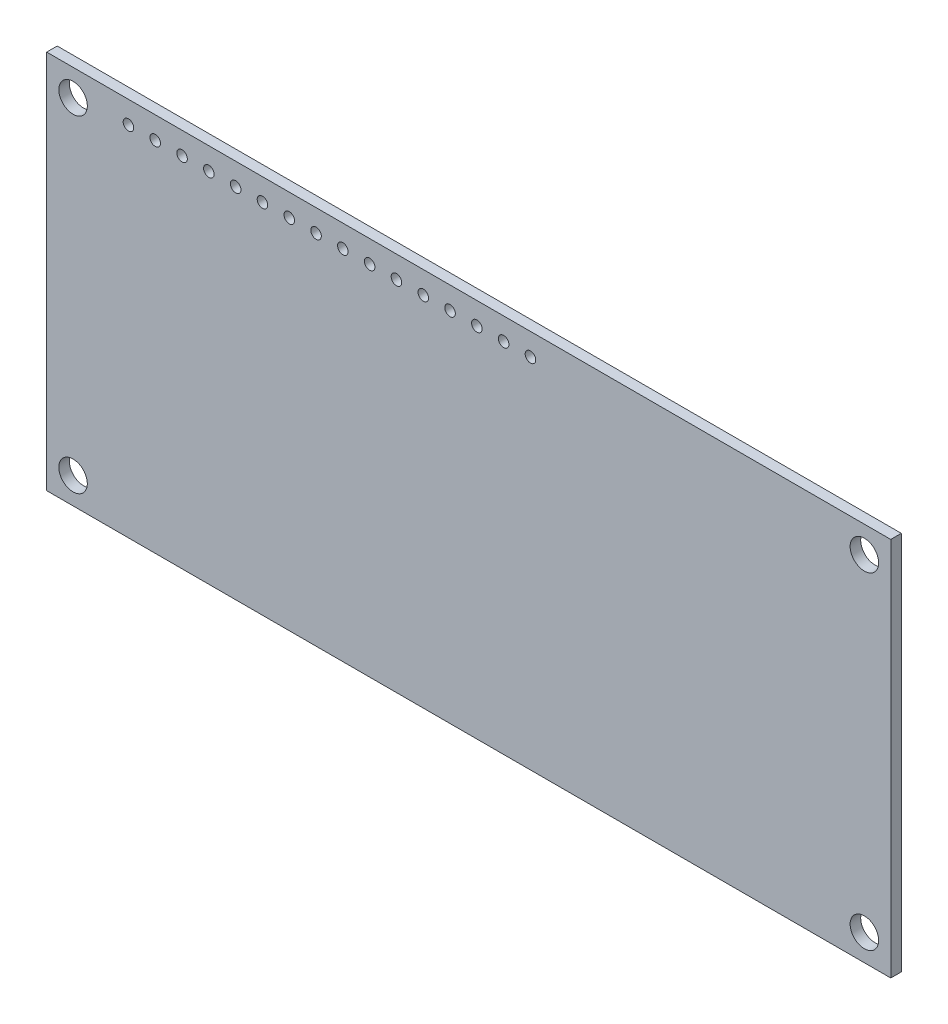
ISO-10303-21;
HEADER;
FILE_DESCRIPTION(('STEP AP214'),'2;1');
FILE_NAME('part.step','',(''),(''),'','','');
FILE_SCHEMA(('AUTOMOTIVE_DESIGN { 1 0 10303 214 1 1 1 1 }'));
ENDSEC;
DATA;
#1=APPLICATION_CONTEXT('core data for automotive mechanical design processes');
#2=APPLICATION_PROTOCOL_DEFINITION('international standard','automotive_design',2000,#1);
#3=PRODUCT_CONTEXT('',#1,'mechanical');
#4=PRODUCT('Part','Part','',(#3));
#5=PRODUCT_RELATED_PRODUCT_CATEGORY('part','',(#4));
#6=PRODUCT_DEFINITION_FORMATION('','',#4);
#7=PRODUCT_DEFINITION_CONTEXT('part definition',#1,'design');
#8=PRODUCT_DEFINITION('design','',#6,#7);
#9=PRODUCT_DEFINITION_SHAPE('','',#8);
#10=(LENGTH_UNIT() NAMED_UNIT(*) SI_UNIT(.MILLI.,.METRE.));
#11=(NAMED_UNIT(*) PLANE_ANGLE_UNIT() SI_UNIT($,.RADIAN.));
#12=(NAMED_UNIT(*) SI_UNIT($,.STERADIAN.) SOLID_ANGLE_UNIT());
#13=UNCERTAINTY_MEASURE_WITH_UNIT(LENGTH_MEASURE(1.E-05),#10,'distance_accuracy_value','');
#14=(GEOMETRIC_REPRESENTATION_CONTEXT(3) GLOBAL_UNCERTAINTY_ASSIGNED_CONTEXT((#13)) GLOBAL_UNIT_ASSIGNED_CONTEXT((#10,
#11,#12)) REPRESENTATION_CONTEXT('',''));
#15=CARTESIAN_POINT('',(0.,0.,0.));
#16=DIRECTION('',(0.,0.,1.));
#17=DIRECTION('',(1.,0.,0.));
#18=AXIS2_PLACEMENT_3D('',#15,#16,#17);
#19=CARTESIAN_POINT('',(0.,0.,-1.));
#20=DIRECTION('',(0.,0.,-1.));
#21=DIRECTION('',(-1.,0.,0.));
#22=AXIS2_PLACEMENT_3D('',#19,#20,#21);
#23=PLANE('',#22);
#24=CARTESIAN_POINT('',(-32.25,15.9,-1.));
#25=DIRECTION('',(0.,0.,-1.));
#26=DIRECTION('',(-1.,0.,0.));
#27=AXIS2_PLACEMENT_3D('',#24,#25,#26);
#28=CIRCLE('',#27,0.5);
#29=CARTESIAN_POINT('',(-32.75,15.9,-1.));
#30=VERTEX_POINT('',#29);
#31=EDGE_CURVE('E138',#30,#30,#28,.F.);
#32=ORIENTED_EDGE('',*,*,#31,.T.);
#33=EDGE_LOOP('',(#32));
#34=FACE_BOUND('',#33,.T.);
#35=CARTESIAN_POINT('',(-29.71,15.9,-1.));
#36=DIRECTION('',(0.,0.,-1.));
#37=DIRECTION('',(-1.,0.,0.));
#38=AXIS2_PLACEMENT_3D('',#35,#36,#37);
#39=CIRCLE('',#38,0.5);
#40=CARTESIAN_POINT('',(-30.21,15.9,-1.));
#41=VERTEX_POINT('',#40);
#42=EDGE_CURVE('E142',#41,#41,#39,.F.);
#43=ORIENTED_EDGE('',*,*,#42,.T.);
#44=EDGE_LOOP('',(#43));
#45=FACE_BOUND('',#44,.T.);
#46=CARTESIAN_POINT('',(-27.17,15.9,-1.));
#47=DIRECTION('',(0.,0.,-1.));
#48=DIRECTION('',(-1.,0.,0.));
#49=AXIS2_PLACEMENT_3D('',#46,#47,#48);
#50=CIRCLE('',#49,0.5);
#51=CARTESIAN_POINT('',(-27.67,15.9,-1.));
#52=VERTEX_POINT('',#51);
#53=EDGE_CURVE('E145',#52,#52,#50,.F.);
#54=ORIENTED_EDGE('',*,*,#53,.T.);
#55=EDGE_LOOP('',(#54));
#56=FACE_BOUND('',#55,.T.);
#57=CARTESIAN_POINT('',(-24.63,15.9,-1.));
#58=DIRECTION('',(0.,0.,-1.));
#59=DIRECTION('',(-1.,0.,0.));
#60=AXIS2_PLACEMENT_3D('',#57,#58,#59);
#61=CIRCLE('',#60,0.5);
#62=CARTESIAN_POINT('',(-25.13,15.9,-1.));
#63=VERTEX_POINT('',#62);
#64=EDGE_CURVE('E148',#63,#63,#61,.F.);
#65=ORIENTED_EDGE('',*,*,#64,.T.);
#66=EDGE_LOOP('',(#65));
#67=FACE_BOUND('',#66,.T.);
#68=CARTESIAN_POINT('',(-22.09,15.9,-1.));
#69=DIRECTION('',(0.,0.,-1.));
#70=DIRECTION('',(-1.,0.,0.));
#71=AXIS2_PLACEMENT_3D('',#68,#69,#70);
#72=CIRCLE('',#71,0.5);
#73=CARTESIAN_POINT('',(-22.59,15.9,-1.));
#74=VERTEX_POINT('',#73);
#75=EDGE_CURVE('E151',#74,#74,#72,.F.);
#76=ORIENTED_EDGE('',*,*,#75,.T.);
#77=EDGE_LOOP('',(#76));
#78=FACE_BOUND('',#77,.T.);
#79=CARTESIAN_POINT('',(-19.55,15.9,-1.));
#80=DIRECTION('',(0.,0.,-1.));
#81=DIRECTION('',(-1.,0.,0.));
#82=AXIS2_PLACEMENT_3D('',#79,#80,#81);
#83=CIRCLE('',#82,0.5);
#84=CARTESIAN_POINT('',(-20.05,15.9,-1.));
#85=VERTEX_POINT('',#84);
#86=EDGE_CURVE('E154',#85,#85,#83,.F.);
#87=ORIENTED_EDGE('',*,*,#86,.T.);
#88=EDGE_LOOP('',(#87));
#89=FACE_BOUND('',#88,.T.);
#90=CARTESIAN_POINT('',(-17.01,15.9,-1.));
#91=DIRECTION('',(0.,0.,-1.));
#92=DIRECTION('',(-1.,0.,0.));
#93=AXIS2_PLACEMENT_3D('',#90,#91,#92);
#94=CIRCLE('',#93,0.5);
#95=CARTESIAN_POINT('',(-17.51,15.9,-1.));
#96=VERTEX_POINT('',#95);
#97=EDGE_CURVE('E157',#96,#96,#94,.F.);
#98=ORIENTED_EDGE('',*,*,#97,.T.);
#99=EDGE_LOOP('',(#98));
#100=FACE_BOUND('',#99,.T.);
#101=CARTESIAN_POINT('',(-14.47,15.9,-1.));
#102=DIRECTION('',(0.,0.,-1.));
#103=DIRECTION('',(-1.,0.,0.));
#104=AXIS2_PLACEMENT_3D('',#101,#102,#103);
#105=CIRCLE('',#104,0.5);
#106=CARTESIAN_POINT('',(-14.97,15.9,-1.));
#107=VERTEX_POINT('',#106);
#108=EDGE_CURVE('E160',#107,#107,#105,.F.);
#109=ORIENTED_EDGE('',*,*,#108,.T.);
#110=EDGE_LOOP('',(#109));
#111=FACE_BOUND('',#110,.T.);
#112=CARTESIAN_POINT('',(-11.93,15.9,-1.));
#113=DIRECTION('',(0.,0.,-1.));
#114=DIRECTION('',(-1.,0.,0.));
#115=AXIS2_PLACEMENT_3D('',#112,#113,#114);
#116=CIRCLE('',#115,0.5);
#117=CARTESIAN_POINT('',(-12.43,15.9,-1.));
#118=VERTEX_POINT('',#117);
#119=EDGE_CURVE('E163',#118,#118,#116,.F.);
#120=ORIENTED_EDGE('',*,*,#119,.T.);
#121=EDGE_LOOP('',(#120));
#122=FACE_BOUND('',#121,.T.);
#123=CARTESIAN_POINT('',(-9.39,15.9,-1.));
#124=DIRECTION('',(0.,0.,-1.));
#125=DIRECTION('',(-1.,0.,0.));
#126=AXIS2_PLACEMENT_3D('',#123,#124,#125);
#127=CIRCLE('',#126,0.5);
#128=CARTESIAN_POINT('',(-9.89,15.9,-1.));
#129=VERTEX_POINT('',#128);
#130=EDGE_CURVE('E166',#129,#129,#127,.F.);
#131=ORIENTED_EDGE('',*,*,#130,.T.);
#132=EDGE_LOOP('',(#131));
#133=FACE_BOUND('',#132,.T.);
#134=CARTESIAN_POINT('',(-6.85,15.9,-1.));
#135=DIRECTION('',(0.,0.,-1.));
#136=DIRECTION('',(-1.,0.,0.));
#137=AXIS2_PLACEMENT_3D('',#134,#135,#136);
#138=CIRCLE('',#137,0.5);
#139=CARTESIAN_POINT('',(-7.35,15.9,-1.));
#140=VERTEX_POINT('',#139);
#141=EDGE_CURVE('E169',#140,#140,#138,.F.);
#142=ORIENTED_EDGE('',*,*,#141,.T.);
#143=EDGE_LOOP('',(#142));
#144=FACE_BOUND('',#143,.T.);
#145=CARTESIAN_POINT('',(-4.31,15.9,-1.));
#146=DIRECTION('',(0.,0.,-1.));
#147=DIRECTION('',(-1.,0.,0.));
#148=AXIS2_PLACEMENT_3D('',#145,#146,#147);
#149=CIRCLE('',#148,0.5);
#150=CARTESIAN_POINT('',(-4.81,15.9,-1.));
#151=VERTEX_POINT('',#150);
#152=EDGE_CURVE('E172',#151,#151,#149,.F.);
#153=ORIENTED_EDGE('',*,*,#152,.T.);
#154=EDGE_LOOP('',(#153));
#155=FACE_BOUND('',#154,.T.);
#156=CARTESIAN_POINT('',(-1.77,15.9,-1.));
#157=DIRECTION('',(0.,0.,-1.));
#158=DIRECTION('',(-1.,0.,0.));
#159=AXIS2_PLACEMENT_3D('',#156,#157,#158);
#160=CIRCLE('',#159,0.5);
#161=CARTESIAN_POINT('',(-2.27,15.9,-1.));
#162=VERTEX_POINT('',#161);
#163=EDGE_CURVE('E175',#162,#162,#160,.F.);
#164=ORIENTED_EDGE('',*,*,#163,.T.);
#165=EDGE_LOOP('',(#164));
#166=FACE_BOUND('',#165,.T.);
#167=CARTESIAN_POINT('',(0.77,15.9,-1.));
#168=DIRECTION('',(0.,0.,-1.));
#169=DIRECTION('',(-1.,0.,0.));
#170=AXIS2_PLACEMENT_3D('',#167,#168,#169);
#171=CIRCLE('',#170,0.5);
#172=CARTESIAN_POINT('',(0.27,15.9,-1.));
#173=VERTEX_POINT('',#172);
#174=EDGE_CURVE('E178',#173,#173,#171,.F.);
#175=ORIENTED_EDGE('',*,*,#174,.T.);
#176=EDGE_LOOP('',(#175));
#177=FACE_BOUND('',#176,.T.);
#178=CARTESIAN_POINT('',(3.31,15.9,-1.));
#179=DIRECTION('',(0.,0.,-1.));
#180=DIRECTION('',(-1.,0.,0.));
#181=AXIS2_PLACEMENT_3D('',#178,#179,#180);
#182=CIRCLE('',#181,0.5);
#183=CARTESIAN_POINT('',(2.81,15.9,-1.));
#184=VERTEX_POINT('',#183);
#185=EDGE_CURVE('E181',#184,#184,#182,.F.);
#186=ORIENTED_EDGE('',*,*,#185,.T.);
#187=EDGE_LOOP('',(#186));
#188=FACE_BOUND('',#187,.T.);
#189=CARTESIAN_POINT('',(5.85,15.9,-1.));
#190=DIRECTION('',(0.,0.,-1.));
#191=DIRECTION('',(-1.,0.,0.));
#192=AXIS2_PLACEMENT_3D('',#189,#190,#191);
#193=CIRCLE('',#192,0.5);
#194=CARTESIAN_POINT('',(5.35,15.9,-1.));
#195=VERTEX_POINT('',#194);
#196=EDGE_CURVE('E184',#195,#195,#193,.F.);
#197=ORIENTED_EDGE('',*,*,#196,.T.);
#198=EDGE_LOOP('',(#197));
#199=FACE_BOUND('',#198,.T.);
#200=CARTESIAN_POINT('',(-37.5,15.5,-1.));
#201=DIRECTION('',(0.,0.,-1.));
#202=DIRECTION('',(-1.,0.,0.));
#203=AXIS2_PLACEMENT_3D('',#200,#201,#202);
#204=CIRCLE('',#203,1.35);
#205=CARTESIAN_POINT('',(-38.85,15.5,-1.));
#206=VERTEX_POINT('',#205);
#207=EDGE_CURVE('E187',#206,#206,#204,.F.);
#208=ORIENTED_EDGE('',*,*,#207,.T.);
#209=EDGE_LOOP('',(#208));
#210=FACE_BOUND('',#209,.T.);
#211=CARTESIAN_POINT('',(-37.5,-15.5,-1.));
#212=DIRECTION('',(0.,0.,-1.));
#213=DIRECTION('',(-1.,0.,0.));
#214=AXIS2_PLACEMENT_3D('',#211,#212,#213);
#215=CIRCLE('',#214,1.35);
#216=CARTESIAN_POINT('',(-38.85,-15.5,-1.));
#217=VERTEX_POINT('',#216);
#218=EDGE_CURVE('E190',#217,#217,#215,.F.);
#219=ORIENTED_EDGE('',*,*,#218,.T.);
#220=EDGE_LOOP('',(#219));
#221=FACE_BOUND('',#220,.T.);
#222=CARTESIAN_POINT('',(37.5,15.5,-1.));
#223=DIRECTION('',(0.,0.,-1.));
#224=DIRECTION('',(-1.,0.,0.));
#225=AXIS2_PLACEMENT_3D('',#222,#223,#224);
#226=CIRCLE('',#225,1.35);
#227=CARTESIAN_POINT('',(36.15,15.5,-1.));
#228=VERTEX_POINT('',#227);
#229=EDGE_CURVE('E192',#228,#228,#226,.F.);
#230=ORIENTED_EDGE('',*,*,#229,.T.);
#231=EDGE_LOOP('',(#230));
#232=FACE_BOUND('',#231,.T.);
#233=CARTESIAN_POINT('',(37.5,-15.5,-1.));
#234=DIRECTION('',(0.,0.,-1.));
#235=DIRECTION('',(-1.,0.,0.));
#236=AXIS2_PLACEMENT_3D('',#233,#234,#235);
#237=CIRCLE('',#236,1.35);
#238=CARTESIAN_POINT('',(36.15,-15.5,-1.));
#239=VERTEX_POINT('',#238);
#240=EDGE_CURVE('E20',#239,#239,#237,.F.);
#241=ORIENTED_EDGE('',*,*,#240,.T.);
#242=EDGE_LOOP('',(#241));
#243=FACE_BOUND('',#242,.T.);
#244=DIRECTION('',(1.,0.,0.));
#245=VECTOR('',#244,1.);
#246=CARTESIAN_POINT('',(-40.,18.,-1.));
#247=LINE('',#246,#245);
#248=CARTESIAN_POINT('',(40.,18.,-1.));
#249=VERTEX_POINT('',#248);
#250=CARTESIAN_POINT('',(-40.,18.,-1.));
#251=VERTEX_POINT('',#250);
#252=EDGE_CURVE('E70',#249,#251,#247,.F.);
#253=ORIENTED_EDGE('',*,*,#252,.F.);
#254=DIRECTION('',(0.,1.,0.));
#255=VECTOR('',#254,1.);
#256=CARTESIAN_POINT('',(40.,18.,-1.));
#257=LINE('',#256,#255);
#258=CARTESIAN_POINT('',(40.,-18.,-1.));
#259=VERTEX_POINT('',#258);
#260=EDGE_CURVE('E55',#259,#249,#257,.T.);
#261=ORIENTED_EDGE('',*,*,#260,.F.);
#262=DIRECTION('',(1.,0.,0.));
#263=VECTOR('',#262,1.);
#264=CARTESIAN_POINT('',(40.,-18.,-1.));
#265=LINE('',#264,#263);
#266=CARTESIAN_POINT('',(-40.,-18.,-1.));
#267=VERTEX_POINT('',#266);
#268=EDGE_CURVE('E60',#267,#259,#265,.T.);
#269=ORIENTED_EDGE('',*,*,#268,.F.);
#270=DIRECTION('',(0.,1.,0.));
#271=VECTOR('',#270,1.);
#272=CARTESIAN_POINT('',(-40.,-18.,-1.));
#273=LINE('',#272,#271);
#274=EDGE_CURVE('E199',#251,#267,#273,.F.);
#275=ORIENTED_EDGE('',*,*,#274,.F.);
#276=EDGE_LOOP('',(#253,#261,#269,#275));
#277=FACE_BOUND('',#276,.T.);
#278=ADVANCED_FACE('F17',(#34,#45,#56,#67,#78,#89,#100,#111,#122,#133,#144,#155,#166,#177,#188,
#199,#210,#221,#232,#243,#277),#23,.T.);
#279=CARTESIAN_POINT('',(40.,-18.,0.));
#280=DIRECTION('',(0.,-1.,0.));
#281=DIRECTION('',(0.,0.,-1.));
#282=AXIS2_PLACEMENT_3D('',#279,#280,#281);
#283=PLANE('',#282);
#284=ORIENTED_EDGE('',*,*,#268,.T.);
#285=DIRECTION('',(0.,0.,-1.));
#286=VECTOR('',#285,1.);
#287=CARTESIAN_POINT('',(40.,-18.,0.));
#288=LINE('',#287,#286);
#289=CARTESIAN_POINT('',(40.,-18.,0.));
#290=VERTEX_POINT('',#289);
#291=EDGE_CURVE('E62',#290,#259,#288,.T.);
#292=ORIENTED_EDGE('',*,*,#291,.F.);
#293=DIRECTION('',(1.,0.,0.));
#294=VECTOR('',#293,1.);
#295=CARTESIAN_POINT('',(0.,-18.,0.));
#296=LINE('',#295,#294);
#297=CARTESIAN_POINT('',(-40.,-18.,0.));
#298=VERTEX_POINT('',#297);
#299=EDGE_CURVE('E141',#298,#290,#296,.T.);
#300=ORIENTED_EDGE('',*,*,#299,.F.);
#301=DIRECTION('',(0.,0.,1.));
#302=VECTOR('',#301,1.);
#303=CARTESIAN_POINT('',(-40.,-18.,0.));
#304=LINE('',#303,#302);
#305=EDGE_CURVE('E65',#267,#298,#304,.T.);
#306=ORIENTED_EDGE('',*,*,#305,.F.);
#307=EDGE_LOOP('',(#284,#292,#300,#306));
#308=FACE_BOUND('',#307,.T.);
#309=ADVANCED_FACE('F61',(#308),#283,.T.);
#310=CARTESIAN_POINT('',(40.,18.,0.));
#311=DIRECTION('',(1.,0.,0.));
#312=DIRECTION('',(0.,0.,-1.));
#313=AXIS2_PLACEMENT_3D('',#310,#311,#312);
#314=PLANE('',#313);
#315=ORIENTED_EDGE('',*,*,#260,.T.);
#316=DIRECTION('',(0.,0.,1.));
#317=VECTOR('',#316,1.);
#318=CARTESIAN_POINT('',(40.,18.,0.));
#319=LINE('',#318,#317);
#320=CARTESIAN_POINT('',(40.,18.,0.));
#321=VERTEX_POINT('',#320);
#322=EDGE_CURVE('E72',#321,#249,#319,.F.);
#323=ORIENTED_EDGE('',*,*,#322,.F.);
#324=DIRECTION('',(0.,1.,0.));
#325=VECTOR('',#324,1.);
#326=CARTESIAN_POINT('',(40.,0.,0.));
#327=LINE('',#326,#325);
#328=EDGE_CURVE('E76',#290,#321,#327,.T.);
#329=ORIENTED_EDGE('',*,*,#328,.F.);
#330=ORIENTED_EDGE('',*,*,#291,.T.);
#331=EDGE_LOOP('',(#315,#323,#329,#330));
#332=FACE_BOUND('',#331,.T.);
#333=ADVANCED_FACE('F74',(#332),#314,.T.);
#334=CARTESIAN_POINT('',(-40.,18.,0.));
#335=DIRECTION('',(0.,1.,0.));
#336=DIRECTION('',(0.,0.,1.));
#337=AXIS2_PLACEMENT_3D('',#334,#335,#336);
#338=PLANE('',#337);
#339=ORIENTED_EDGE('',*,*,#252,.T.);
#340=DIRECTION('',(0.,0.,1.));
#341=VECTOR('',#340,1.);
#342=CARTESIAN_POINT('',(-40.,18.,0.));
#343=LINE('',#342,#341);
#344=CARTESIAN_POINT('',(-40.,18.,0.));
#345=VERTEX_POINT('',#344);
#346=EDGE_CURVE('E35',#345,#251,#343,.F.);
#347=ORIENTED_EDGE('',*,*,#346,.F.);
#348=DIRECTION('',(1.,0.,0.));
#349=VECTOR('',#348,1.);
#350=CARTESIAN_POINT('',(0.,18.,0.));
#351=LINE('',#350,#349);
#352=EDGE_CURVE('E210',#321,#345,#351,.F.);
#353=ORIENTED_EDGE('',*,*,#352,.F.);
#354=ORIENTED_EDGE('',*,*,#322,.T.);
#355=EDGE_LOOP('',(#339,#347,#353,#354));
#356=FACE_BOUND('',#355,.T.);
#357=ADVANCED_FACE('F208',(#356),#338,.T.);
#358=CARTESIAN_POINT('',(-40.,-18.,0.));
#359=DIRECTION('',(-1.,0.,0.));
#360=DIRECTION('',(0.,0.,1.));
#361=AXIS2_PLACEMENT_3D('',#358,#359,#360);
#362=PLANE('',#361);
#363=ORIENTED_EDGE('',*,*,#274,.T.);
#364=ORIENTED_EDGE('',*,*,#305,.T.);
#365=DIRECTION('',(0.,1.,0.));
#366=VECTOR('',#365,1.);
#367=CARTESIAN_POINT('',(-40.,0.,0.));
#368=LINE('',#367,#366);
#369=EDGE_CURVE('E137',#345,#298,#368,.F.);
#370=ORIENTED_EDGE('',*,*,#369,.F.);
#371=ORIENTED_EDGE('',*,*,#346,.T.);
#372=EDGE_LOOP('',(#363,#364,#370,#371));
#373=FACE_BOUND('',#372,.T.);
#374=ADVANCED_FACE('F215',(#373),#362,.T.);
#375=CARTESIAN_POINT('',(37.5,-15.5,0.));
#376=DIRECTION('',(0.,0.,-1.));
#377=DIRECTION('',(-1.,0.,0.));
#378=AXIS2_PLACEMENT_3D('',#375,#376,#377);
#379=CYLINDRICAL_SURFACE('',#378,1.35);
#380=CARTESIAN_POINT('',(37.5,-15.5,0.));
#381=DIRECTION('',(0.,0.,-1.));
#382=DIRECTION('',(-1.,0.,0.));
#383=AXIS2_PLACEMENT_3D('',#380,#381,#382);
#384=CIRCLE('',#383,1.35);
#385=CARTESIAN_POINT('',(36.15,-15.5,0.));
#386=VERTEX_POINT('',#385);
#387=EDGE_CURVE('E134',#386,#386,#384,.T.);
#388=ORIENTED_EDGE('',*,*,#387,.F.);
#389=EDGE_LOOP('',(#388));
#390=FACE_BOUND('',#389,.T.);
#391=ORIENTED_EDGE('',*,*,#240,.F.);
#392=EDGE_LOOP('',(#391));
#393=FACE_BOUND('',#392,.T.);
#394=ADVANCED_FACE('F217',(#390,#393),#379,.F.);
#395=CARTESIAN_POINT('',(37.5,15.5,0.));
#396=DIRECTION('',(0.,0.,-1.));
#397=DIRECTION('',(-1.,0.,0.));
#398=AXIS2_PLACEMENT_3D('',#395,#396,#397);
#399=CYLINDRICAL_SURFACE('',#398,1.35);
#400=CARTESIAN_POINT('',(37.5,15.5,0.));
#401=DIRECTION('',(0.,0.,-1.));
#402=DIRECTION('',(-1.,0.,0.));
#403=AXIS2_PLACEMENT_3D('',#400,#401,#402);
#404=CIRCLE('',#403,1.35);
#405=CARTESIAN_POINT('',(36.15,15.5,0.));
#406=VERTEX_POINT('',#405);
#407=EDGE_CURVE('E131',#406,#406,#404,.T.);
#408=ORIENTED_EDGE('',*,*,#407,.F.);
#409=EDGE_LOOP('',(#408));
#410=FACE_BOUND('',#409,.T.);
#411=ORIENTED_EDGE('',*,*,#229,.F.);
#412=EDGE_LOOP('',(#411));
#413=FACE_BOUND('',#412,.T.);
#414=ADVANCED_FACE('F224',(#410,#413),#399,.F.);
#415=CARTESIAN_POINT('',(-37.5,-15.5,0.));
#416=DIRECTION('',(0.,0.,-1.));
#417=DIRECTION('',(-1.,0.,0.));
#418=AXIS2_PLACEMENT_3D('',#415,#416,#417);
#419=CYLINDRICAL_SURFACE('',#418,1.35);
#420=CARTESIAN_POINT('',(-37.5,-15.5,0.));
#421=DIRECTION('',(0.,0.,-1.));
#422=DIRECTION('',(-1.,0.,0.));
#423=AXIS2_PLACEMENT_3D('',#420,#421,#422);
#424=CIRCLE('',#423,1.35);
#425=CARTESIAN_POINT('',(-38.85,-15.5,0.));
#426=VERTEX_POINT('',#425);
#427=EDGE_CURVE('E128',#426,#426,#424,.T.);
#428=ORIENTED_EDGE('',*,*,#427,.F.);
#429=EDGE_LOOP('',(#428));
#430=FACE_BOUND('',#429,.T.);
#431=ORIENTED_EDGE('',*,*,#218,.F.);
#432=EDGE_LOOP('',(#431));
#433=FACE_BOUND('',#432,.T.);
#434=ADVANCED_FACE('F302',(#430,#433),#419,.F.);
#435=CARTESIAN_POINT('',(-37.5,15.5,0.));
#436=DIRECTION('',(0.,0.,-1.));
#437=DIRECTION('',(-1.,0.,0.));
#438=AXIS2_PLACEMENT_3D('',#435,#436,#437);
#439=CYLINDRICAL_SURFACE('',#438,1.35);
#440=CARTESIAN_POINT('',(-37.5,15.5,0.));
#441=DIRECTION('',(0.,0.,-1.));
#442=DIRECTION('',(-1.,0.,0.));
#443=AXIS2_PLACEMENT_3D('',#440,#441,#442);
#444=CIRCLE('',#443,1.35);
#445=CARTESIAN_POINT('',(-38.85,15.5,0.));
#446=VERTEX_POINT('',#445);
#447=EDGE_CURVE('E125',#446,#446,#444,.T.);
#448=ORIENTED_EDGE('',*,*,#447,.F.);
#449=EDGE_LOOP('',(#448));
#450=FACE_BOUND('',#449,.T.);
#451=ORIENTED_EDGE('',*,*,#207,.F.);
#452=EDGE_LOOP('',(#451));
#453=FACE_BOUND('',#452,.T.);
#454=ADVANCED_FACE('F298',(#450,#453),#439,.F.);
#455=CARTESIAN_POINT('',(5.85,15.9,0.));
#456=DIRECTION('',(0.,0.,-1.));
#457=DIRECTION('',(-1.,0.,0.));
#458=AXIS2_PLACEMENT_3D('',#455,#456,#457);
#459=CYLINDRICAL_SURFACE('',#458,0.5);
#460=CARTESIAN_POINT('',(5.85,15.9,0.));
#461=DIRECTION('',(0.,0.,-1.));
#462=DIRECTION('',(-1.,0.,0.));
#463=AXIS2_PLACEMENT_3D('',#460,#461,#462);
#464=CIRCLE('',#463,0.5);
#465=CARTESIAN_POINT('',(5.35,15.9,0.));
#466=VERTEX_POINT('',#465);
#467=EDGE_CURVE('E122',#466,#466,#464,.T.);
#468=ORIENTED_EDGE('',*,*,#467,.F.);
#469=EDGE_LOOP('',(#468));
#470=FACE_BOUND('',#469,.T.);
#471=ORIENTED_EDGE('',*,*,#196,.F.);
#472=EDGE_LOOP('',(#471));
#473=FACE_BOUND('',#472,.T.);
#474=ADVANCED_FACE('F294',(#470,#473),#459,.F.);
#475=CARTESIAN_POINT('',(3.31,15.9,0.));
#476=DIRECTION('',(0.,0.,-1.));
#477=DIRECTION('',(-1.,0.,0.));
#478=AXIS2_PLACEMENT_3D('',#475,#476,#477);
#479=CYLINDRICAL_SURFACE('',#478,0.5);
#480=CARTESIAN_POINT('',(3.31,15.9,0.));
#481=DIRECTION('',(0.,0.,-1.));
#482=DIRECTION('',(-1.,0.,0.));
#483=AXIS2_PLACEMENT_3D('',#480,#481,#482);
#484=CIRCLE('',#483,0.5);
#485=CARTESIAN_POINT('',(2.81,15.9,0.));
#486=VERTEX_POINT('',#485);
#487=EDGE_CURVE('E119',#486,#486,#484,.T.);
#488=ORIENTED_EDGE('',*,*,#487,.F.);
#489=EDGE_LOOP('',(#488));
#490=FACE_BOUND('',#489,.T.);
#491=ORIENTED_EDGE('',*,*,#185,.F.);
#492=EDGE_LOOP('',(#491));
#493=FACE_BOUND('',#492,.T.);
#494=ADVANCED_FACE('F290',(#490,#493),#479,.F.);
#495=CARTESIAN_POINT('',(0.77,15.9,0.));
#496=DIRECTION('',(0.,0.,-1.));
#497=DIRECTION('',(-1.,0.,0.));
#498=AXIS2_PLACEMENT_3D('',#495,#496,#497);
#499=CYLINDRICAL_SURFACE('',#498,0.5);
#500=CARTESIAN_POINT('',(0.77,15.9,0.));
#501=DIRECTION('',(0.,0.,-1.));
#502=DIRECTION('',(-1.,0.,0.));
#503=AXIS2_PLACEMENT_3D('',#500,#501,#502);
#504=CIRCLE('',#503,0.5);
#505=CARTESIAN_POINT('',(0.27,15.9,0.));
#506=VERTEX_POINT('',#505);
#507=EDGE_CURVE('E116',#506,#506,#504,.T.);
#508=ORIENTED_EDGE('',*,*,#507,.F.);
#509=EDGE_LOOP('',(#508));
#510=FACE_BOUND('',#509,.T.);
#511=ORIENTED_EDGE('',*,*,#174,.F.);
#512=EDGE_LOOP('',(#511));
#513=FACE_BOUND('',#512,.T.);
#514=ADVANCED_FACE('F286',(#510,#513),#499,.F.);
#515=CARTESIAN_POINT('',(-1.77,15.9,0.));
#516=DIRECTION('',(0.,0.,-1.));
#517=DIRECTION('',(-1.,0.,0.));
#518=AXIS2_PLACEMENT_3D('',#515,#516,#517);
#519=CYLINDRICAL_SURFACE('',#518,0.5);
#520=CARTESIAN_POINT('',(-1.77,15.9,0.));
#521=DIRECTION('',(0.,0.,-1.));
#522=DIRECTION('',(-1.,0.,0.));
#523=AXIS2_PLACEMENT_3D('',#520,#521,#522);
#524=CIRCLE('',#523,0.5);
#525=CARTESIAN_POINT('',(-2.27,15.9,0.));
#526=VERTEX_POINT('',#525);
#527=EDGE_CURVE('E113',#526,#526,#524,.T.);
#528=ORIENTED_EDGE('',*,*,#527,.F.);
#529=EDGE_LOOP('',(#528));
#530=FACE_BOUND('',#529,.T.);
#531=ORIENTED_EDGE('',*,*,#163,.F.);
#532=EDGE_LOOP('',(#531));
#533=FACE_BOUND('',#532,.T.);
#534=ADVANCED_FACE('F282',(#530,#533),#519,.F.);
#535=CARTESIAN_POINT('',(-4.31,15.9,0.));
#536=DIRECTION('',(0.,0.,-1.));
#537=DIRECTION('',(-1.,0.,0.));
#538=AXIS2_PLACEMENT_3D('',#535,#536,#537);
#539=CYLINDRICAL_SURFACE('',#538,0.5);
#540=CARTESIAN_POINT('',(-4.31,15.9,0.));
#541=DIRECTION('',(0.,0.,-1.));
#542=DIRECTION('',(-1.,0.,0.));
#543=AXIS2_PLACEMENT_3D('',#540,#541,#542);
#544=CIRCLE('',#543,0.5);
#545=CARTESIAN_POINT('',(-4.81,15.9,0.));
#546=VERTEX_POINT('',#545);
#547=EDGE_CURVE('E110',#546,#546,#544,.T.);
#548=ORIENTED_EDGE('',*,*,#547,.F.);
#549=EDGE_LOOP('',(#548));
#550=FACE_BOUND('',#549,.T.);
#551=ORIENTED_EDGE('',*,*,#152,.F.);
#552=EDGE_LOOP('',(#551));
#553=FACE_BOUND('',#552,.T.);
#554=ADVANCED_FACE('F278',(#550,#553),#539,.F.);
#555=CARTESIAN_POINT('',(-6.85,15.9,0.));
#556=DIRECTION('',(0.,0.,-1.));
#557=DIRECTION('',(-1.,0.,0.));
#558=AXIS2_PLACEMENT_3D('',#555,#556,#557);
#559=CYLINDRICAL_SURFACE('',#558,0.5);
#560=CARTESIAN_POINT('',(-6.85,15.9,0.));
#561=DIRECTION('',(0.,0.,-1.));
#562=DIRECTION('',(-1.,0.,0.));
#563=AXIS2_PLACEMENT_3D('',#560,#561,#562);
#564=CIRCLE('',#563,0.5);
#565=CARTESIAN_POINT('',(-7.35,15.9,0.));
#566=VERTEX_POINT('',#565);
#567=EDGE_CURVE('E107',#566,#566,#564,.T.);
#568=ORIENTED_EDGE('',*,*,#567,.F.);
#569=EDGE_LOOP('',(#568));
#570=FACE_BOUND('',#569,.T.);
#571=ORIENTED_EDGE('',*,*,#141,.F.);
#572=EDGE_LOOP('',(#571));
#573=FACE_BOUND('',#572,.T.);
#574=ADVANCED_FACE('F274',(#570,#573),#559,.F.);
#575=CARTESIAN_POINT('',(-9.39,15.9,0.));
#576=DIRECTION('',(0.,0.,-1.));
#577=DIRECTION('',(-1.,0.,0.));
#578=AXIS2_PLACEMENT_3D('',#575,#576,#577);
#579=CYLINDRICAL_SURFACE('',#578,0.5);
#580=CARTESIAN_POINT('',(-9.39,15.9,0.));
#581=DIRECTION('',(0.,0.,-1.));
#582=DIRECTION('',(-1.,0.,0.));
#583=AXIS2_PLACEMENT_3D('',#580,#581,#582);
#584=CIRCLE('',#583,0.5);
#585=CARTESIAN_POINT('',(-9.89,15.9,0.));
#586=VERTEX_POINT('',#585);
#587=EDGE_CURVE('E104',#586,#586,#584,.T.);
#588=ORIENTED_EDGE('',*,*,#587,.F.);
#589=EDGE_LOOP('',(#588));
#590=FACE_BOUND('',#589,.T.);
#591=ORIENTED_EDGE('',*,*,#130,.F.);
#592=EDGE_LOOP('',(#591));
#593=FACE_BOUND('',#592,.T.);
#594=ADVANCED_FACE('F270',(#590,#593),#579,.F.);
#595=CARTESIAN_POINT('',(-11.93,15.9,0.));
#596=DIRECTION('',(0.,0.,-1.));
#597=DIRECTION('',(-1.,0.,0.));
#598=AXIS2_PLACEMENT_3D('',#595,#596,#597);
#599=CYLINDRICAL_SURFACE('',#598,0.5);
#600=CARTESIAN_POINT('',(-11.93,15.9,0.));
#601=DIRECTION('',(0.,0.,-1.));
#602=DIRECTION('',(-1.,0.,0.));
#603=AXIS2_PLACEMENT_3D('',#600,#601,#602);
#604=CIRCLE('',#603,0.5);
#605=CARTESIAN_POINT('',(-12.43,15.9,0.));
#606=VERTEX_POINT('',#605);
#607=EDGE_CURVE('E101',#606,#606,#604,.T.);
#608=ORIENTED_EDGE('',*,*,#607,.F.);
#609=EDGE_LOOP('',(#608));
#610=FACE_BOUND('',#609,.T.);
#611=ORIENTED_EDGE('',*,*,#119,.F.);
#612=EDGE_LOOP('',(#611));
#613=FACE_BOUND('',#612,.T.);
#614=ADVANCED_FACE('F266',(#610,#613),#599,.F.);
#615=CARTESIAN_POINT('',(-14.47,15.9,0.));
#616=DIRECTION('',(0.,0.,-1.));
#617=DIRECTION('',(-1.,0.,0.));
#618=AXIS2_PLACEMENT_3D('',#615,#616,#617);
#619=CYLINDRICAL_SURFACE('',#618,0.5);
#620=CARTESIAN_POINT('',(-14.47,15.9,0.));
#621=DIRECTION('',(0.,0.,-1.));
#622=DIRECTION('',(-1.,0.,0.));
#623=AXIS2_PLACEMENT_3D('',#620,#621,#622);
#624=CIRCLE('',#623,0.5);
#625=CARTESIAN_POINT('',(-14.97,15.9,0.));
#626=VERTEX_POINT('',#625);
#627=EDGE_CURVE('E98',#626,#626,#624,.T.);
#628=ORIENTED_EDGE('',*,*,#627,.F.);
#629=EDGE_LOOP('',(#628));
#630=FACE_BOUND('',#629,.T.);
#631=ORIENTED_EDGE('',*,*,#108,.F.);
#632=EDGE_LOOP('',(#631));
#633=FACE_BOUND('',#632,.T.);
#634=ADVANCED_FACE('F262',(#630,#633),#619,.F.);
#635=CARTESIAN_POINT('',(-17.01,15.9,0.));
#636=DIRECTION('',(0.,0.,-1.));
#637=DIRECTION('',(-1.,0.,0.));
#638=AXIS2_PLACEMENT_3D('',#635,#636,#637);
#639=CYLINDRICAL_SURFACE('',#638,0.5);
#640=CARTESIAN_POINT('',(-17.01,15.9,0.));
#641=DIRECTION('',(0.,0.,-1.));
#642=DIRECTION('',(-1.,0.,0.));
#643=AXIS2_PLACEMENT_3D('',#640,#641,#642);
#644=CIRCLE('',#643,0.5);
#645=CARTESIAN_POINT('',(-17.51,15.9,0.));
#646=VERTEX_POINT('',#645);
#647=EDGE_CURVE('E95',#646,#646,#644,.T.);
#648=ORIENTED_EDGE('',*,*,#647,.F.);
#649=EDGE_LOOP('',(#648));
#650=FACE_BOUND('',#649,.T.);
#651=ORIENTED_EDGE('',*,*,#97,.F.);
#652=EDGE_LOOP('',(#651));
#653=FACE_BOUND('',#652,.T.);
#654=ADVANCED_FACE('F258',(#650,#653),#639,.F.);
#655=CARTESIAN_POINT('',(-19.55,15.9,0.));
#656=DIRECTION('',(0.,0.,-1.));
#657=DIRECTION('',(-1.,0.,0.));
#658=AXIS2_PLACEMENT_3D('',#655,#656,#657);
#659=CYLINDRICAL_SURFACE('',#658,0.5);
#660=CARTESIAN_POINT('',(-19.55,15.9,0.));
#661=DIRECTION('',(0.,0.,-1.));
#662=DIRECTION('',(-1.,0.,0.));
#663=AXIS2_PLACEMENT_3D('',#660,#661,#662);
#664=CIRCLE('',#663,0.5);
#665=CARTESIAN_POINT('',(-20.05,15.9,0.));
#666=VERTEX_POINT('',#665);
#667=EDGE_CURVE('E92',#666,#666,#664,.T.);
#668=ORIENTED_EDGE('',*,*,#667,.F.);
#669=EDGE_LOOP('',(#668));
#670=FACE_BOUND('',#669,.T.);
#671=ORIENTED_EDGE('',*,*,#86,.F.);
#672=EDGE_LOOP('',(#671));
#673=FACE_BOUND('',#672,.T.);
#674=ADVANCED_FACE('F254',(#670,#673),#659,.F.);
#675=CARTESIAN_POINT('',(-22.09,15.9,0.));
#676=DIRECTION('',(0.,0.,-1.));
#677=DIRECTION('',(-1.,0.,0.));
#678=AXIS2_PLACEMENT_3D('',#675,#676,#677);
#679=CYLINDRICAL_SURFACE('',#678,0.5);
#680=CARTESIAN_POINT('',(-22.09,15.9,0.));
#681=DIRECTION('',(0.,0.,-1.));
#682=DIRECTION('',(-1.,0.,0.));
#683=AXIS2_PLACEMENT_3D('',#680,#681,#682);
#684=CIRCLE('',#683,0.5);
#685=CARTESIAN_POINT('',(-22.59,15.9,0.));
#686=VERTEX_POINT('',#685);
#687=EDGE_CURVE('E89',#686,#686,#684,.T.);
#688=ORIENTED_EDGE('',*,*,#687,.F.);
#689=EDGE_LOOP('',(#688));
#690=FACE_BOUND('',#689,.T.);
#691=ORIENTED_EDGE('',*,*,#75,.F.);
#692=EDGE_LOOP('',(#691));
#693=FACE_BOUND('',#692,.T.);
#694=ADVANCED_FACE('F250',(#690,#693),#679,.F.);
#695=CARTESIAN_POINT('',(-24.63,15.9,0.));
#696=DIRECTION('',(0.,0.,-1.));
#697=DIRECTION('',(-1.,0.,0.));
#698=AXIS2_PLACEMENT_3D('',#695,#696,#697);
#699=CYLINDRICAL_SURFACE('',#698,0.5);
#700=CARTESIAN_POINT('',(-24.63,15.9,0.));
#701=DIRECTION('',(0.,0.,-1.));
#702=DIRECTION('',(-1.,0.,0.));
#703=AXIS2_PLACEMENT_3D('',#700,#701,#702);
#704=CIRCLE('',#703,0.5);
#705=CARTESIAN_POINT('',(-25.13,15.9,0.));
#706=VERTEX_POINT('',#705);
#707=EDGE_CURVE('E86',#706,#706,#704,.T.);
#708=ORIENTED_EDGE('',*,*,#707,.F.);
#709=EDGE_LOOP('',(#708));
#710=FACE_BOUND('',#709,.T.);
#711=ORIENTED_EDGE('',*,*,#64,.F.);
#712=EDGE_LOOP('',(#711));
#713=FACE_BOUND('',#712,.T.);
#714=ADVANCED_FACE('F246',(#710,#713),#699,.F.);
#715=CARTESIAN_POINT('',(-27.17,15.9,0.));
#716=DIRECTION('',(0.,0.,-1.));
#717=DIRECTION('',(-1.,0.,0.));
#718=AXIS2_PLACEMENT_3D('',#715,#716,#717);
#719=CYLINDRICAL_SURFACE('',#718,0.5);
#720=CARTESIAN_POINT('',(-27.17,15.9,0.));
#721=DIRECTION('',(0.,0.,-1.));
#722=DIRECTION('',(-1.,0.,0.));
#723=AXIS2_PLACEMENT_3D('',#720,#721,#722);
#724=CIRCLE('',#723,0.5);
#725=CARTESIAN_POINT('',(-27.67,15.9,0.));
#726=VERTEX_POINT('',#725);
#727=EDGE_CURVE('E83',#726,#726,#724,.T.);
#728=ORIENTED_EDGE('',*,*,#727,.F.);
#729=EDGE_LOOP('',(#728));
#730=FACE_BOUND('',#729,.T.);
#731=ORIENTED_EDGE('',*,*,#53,.F.);
#732=EDGE_LOOP('',(#731));
#733=FACE_BOUND('',#732,.T.);
#734=ADVANCED_FACE('F242',(#730,#733),#719,.F.);
#735=CARTESIAN_POINT('',(-29.71,15.9,0.));
#736=DIRECTION('',(0.,0.,-1.));
#737=DIRECTION('',(-1.,0.,0.));
#738=AXIS2_PLACEMENT_3D('',#735,#736,#737);
#739=CYLINDRICAL_SURFACE('',#738,0.5);
#740=CARTESIAN_POINT('',(-29.71,15.9,0.));
#741=DIRECTION('',(0.,0.,-1.));
#742=DIRECTION('',(-1.,0.,0.));
#743=AXIS2_PLACEMENT_3D('',#740,#741,#742);
#744=CIRCLE('',#743,0.5);
#745=CARTESIAN_POINT('',(-30.21,15.9,0.));
#746=VERTEX_POINT('',#745);
#747=EDGE_CURVE('E26',#746,#746,#744,.T.);
#748=ORIENTED_EDGE('',*,*,#747,.F.);
#749=EDGE_LOOP('',(#748));
#750=FACE_BOUND('',#749,.T.);
#751=ORIENTED_EDGE('',*,*,#42,.F.);
#752=EDGE_LOOP('',(#751));
#753=FACE_BOUND('',#752,.T.);
#754=ADVANCED_FACE('F235',(#750,#753),#739,.F.);
#755=CARTESIAN_POINT('',(-32.25,15.9,0.));
#756=DIRECTION('',(0.,0.,-1.));
#757=DIRECTION('',(-1.,0.,0.));
#758=AXIS2_PLACEMENT_3D('',#755,#756,#757);
#759=CYLINDRICAL_SURFACE('',#758,0.5);
#760=CARTESIAN_POINT('',(-32.25,15.9,0.));
#761=DIRECTION('',(0.,0.,-1.));
#762=DIRECTION('',(-1.,0.,0.));
#763=AXIS2_PLACEMENT_3D('',#760,#761,#762);
#764=CIRCLE('',#763,0.5);
#765=CARTESIAN_POINT('',(-32.75,15.9,0.));
#766=VERTEX_POINT('',#765);
#767=EDGE_CURVE('E11',#766,#766,#764,.T.);
#768=ORIENTED_EDGE('',*,*,#767,.F.);
#769=EDGE_LOOP('',(#768));
#770=FACE_BOUND('',#769,.T.);
#771=ORIENTED_EDGE('',*,*,#31,.F.);
#772=EDGE_LOOP('',(#771));
#773=FACE_BOUND('',#772,.T.);
#774=ADVANCED_FACE('F229',(#770,#773),#759,.F.);
#775=CARTESIAN_POINT('',(0.,0.,0.));
#776=DIRECTION('',(0.,0.,1.));
#777=DIRECTION('',(1.,0.,0.));
#778=AXIS2_PLACEMENT_3D('',#775,#776,#777);
#779=PLANE('',#778);
#780=ORIENTED_EDGE('',*,*,#767,.T.);
#781=EDGE_LOOP('',(#780));
#782=FACE_BOUND('',#781,.T.);
#783=ORIENTED_EDGE('',*,*,#747,.T.);
#784=EDGE_LOOP('',(#783));
#785=FACE_BOUND('',#784,.T.);
#786=ORIENTED_EDGE('',*,*,#727,.T.);
#787=EDGE_LOOP('',(#786));
#788=FACE_BOUND('',#787,.T.);
#789=ORIENTED_EDGE('',*,*,#707,.T.);
#790=EDGE_LOOP('',(#789));
#791=FACE_BOUND('',#790,.T.);
#792=ORIENTED_EDGE('',*,*,#687,.T.);
#793=EDGE_LOOP('',(#792));
#794=FACE_BOUND('',#793,.T.);
#795=ORIENTED_EDGE('',*,*,#667,.T.);
#796=EDGE_LOOP('',(#795));
#797=FACE_BOUND('',#796,.T.);
#798=ORIENTED_EDGE('',*,*,#647,.T.);
#799=EDGE_LOOP('',(#798));
#800=FACE_BOUND('',#799,.T.);
#801=ORIENTED_EDGE('',*,*,#627,.T.);
#802=EDGE_LOOP('',(#801));
#803=FACE_BOUND('',#802,.T.);
#804=ORIENTED_EDGE('',*,*,#607,.T.);
#805=EDGE_LOOP('',(#804));
#806=FACE_BOUND('',#805,.T.);
#807=ORIENTED_EDGE('',*,*,#587,.T.);
#808=EDGE_LOOP('',(#807));
#809=FACE_BOUND('',#808,.T.);
#810=ORIENTED_EDGE('',*,*,#567,.T.);
#811=EDGE_LOOP('',(#810));
#812=FACE_BOUND('',#811,.T.);
#813=ORIENTED_EDGE('',*,*,#547,.T.);
#814=EDGE_LOOP('',(#813));
#815=FACE_BOUND('',#814,.T.);
#816=ORIENTED_EDGE('',*,*,#527,.T.);
#817=EDGE_LOOP('',(#816));
#818=FACE_BOUND('',#817,.T.);
#819=ORIENTED_EDGE('',*,*,#507,.T.);
#820=EDGE_LOOP('',(#819));
#821=FACE_BOUND('',#820,.T.);
#822=ORIENTED_EDGE('',*,*,#487,.T.);
#823=EDGE_LOOP('',(#822));
#824=FACE_BOUND('',#823,.T.);
#825=ORIENTED_EDGE('',*,*,#467,.T.);
#826=EDGE_LOOP('',(#825));
#827=FACE_BOUND('',#826,.T.);
#828=ORIENTED_EDGE('',*,*,#447,.T.);
#829=EDGE_LOOP('',(#828));
#830=FACE_BOUND('',#829,.T.);
#831=ORIENTED_EDGE('',*,*,#427,.T.);
#832=EDGE_LOOP('',(#831));
#833=FACE_BOUND('',#832,.T.);
#834=ORIENTED_EDGE('',*,*,#407,.T.);
#835=EDGE_LOOP('',(#834));
#836=FACE_BOUND('',#835,.T.);
#837=ORIENTED_EDGE('',*,*,#387,.T.);
#838=EDGE_LOOP('',(#837));
#839=FACE_BOUND('',#838,.T.);
#840=ORIENTED_EDGE('',*,*,#352,.T.);
#841=ORIENTED_EDGE('',*,*,#369,.T.);
#842=ORIENTED_EDGE('',*,*,#299,.T.);
#843=ORIENTED_EDGE('',*,*,#328,.T.);
#844=EDGE_LOOP('',(#840,#841,#842,#843));
#845=FACE_BOUND('',#844,.T.);
#846=ADVANCED_FACE('F213',(#782,#785,#788,#791,#794,#797,#800,#803,#806,#809,#812,#815,#818,
#821,#824,#827,#830,#833,#836,#839,#845),#779,.T.);
#847=CLOSED_SHELL('',(#278,#309,#333,#357,#374,#394,#414,#434,#454,#474,#494,#514,#534,#554,
#574,#594,#614,#634,#654,#674,#694,#714,#734,#754,#774,#846));
#848=MANIFOLD_SOLID_BREP('B1',#847);
#849=ADVANCED_BREP_SHAPE_REPRESENTATION('',(#18,#848),#14);
#850=SHAPE_DEFINITION_REPRESENTATION(#9,#849);
ENDSEC;
END-ISO-10303-21;
